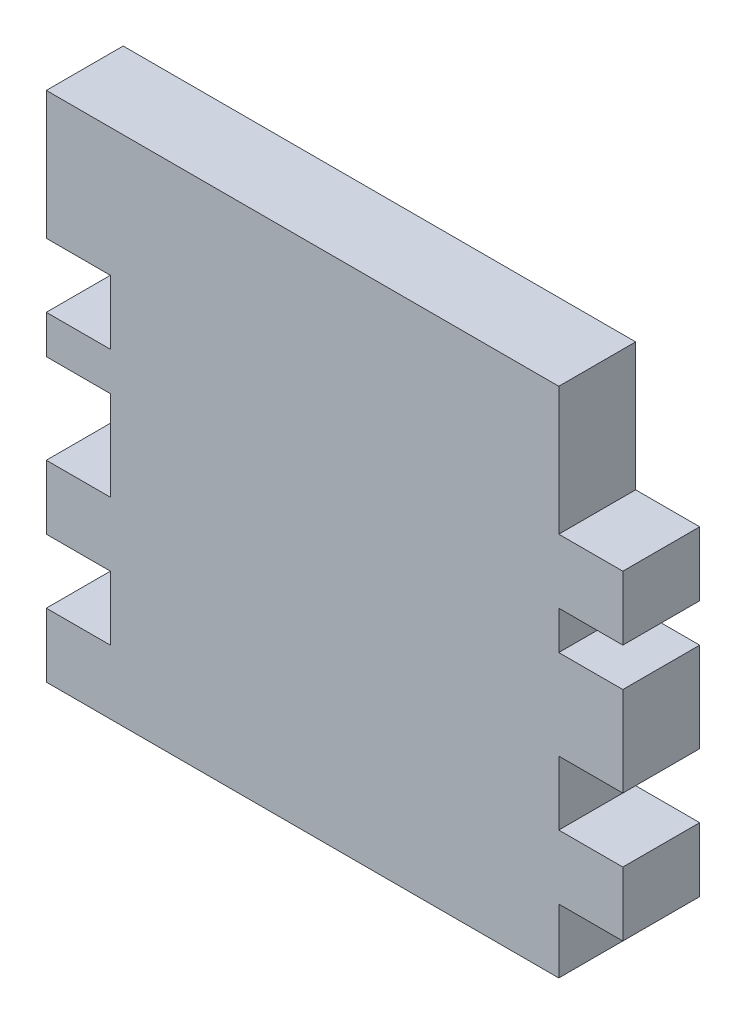
ISO-10303-21;
HEADER;
FILE_DESCRIPTION(('STEP AP214'),'2;1');
FILE_NAME('part.step','',(''),(''),'','','');
FILE_SCHEMA(('AUTOMOTIVE_DESIGN { 1 0 10303 214 1 1 1 1 }'));
ENDSEC;
DATA;
#1=APPLICATION_CONTEXT('core data for automotive mechanical design processes');
#2=APPLICATION_PROTOCOL_DEFINITION('international standard','automotive_design',2000,#1);
#3=PRODUCT_CONTEXT('',#1,'mechanical');
#4=PRODUCT('Part','Part','',(#3));
#5=PRODUCT_RELATED_PRODUCT_CATEGORY('part','',(#4));
#6=PRODUCT_DEFINITION_FORMATION('','',#4);
#7=PRODUCT_DEFINITION_CONTEXT('part definition',#1,'design');
#8=PRODUCT_DEFINITION('design','',#6,#7);
#9=PRODUCT_DEFINITION_SHAPE('','',#8);
#10=(LENGTH_UNIT() NAMED_UNIT(*) SI_UNIT(.MILLI.,.METRE.));
#11=(NAMED_UNIT(*) PLANE_ANGLE_UNIT() SI_UNIT($,.RADIAN.));
#12=(NAMED_UNIT(*) SI_UNIT($,.STERADIAN.) SOLID_ANGLE_UNIT());
#13=UNCERTAINTY_MEASURE_WITH_UNIT(LENGTH_MEASURE(1.E-05),#10,'distance_accuracy_value','');
#14=(GEOMETRIC_REPRESENTATION_CONTEXT(3) GLOBAL_UNCERTAINTY_ASSIGNED_CONTEXT((#13)) GLOBAL_UNIT_ASSIGNED_CONTEXT((#10,
#11,#12)) REPRESENTATION_CONTEXT('',''));
#15=CARTESIAN_POINT('',(0.,0.,0.));
#16=DIRECTION('',(0.,0.,1.));
#17=DIRECTION('',(1.,0.,0.));
#18=AXIS2_PLACEMENT_3D('',#15,#16,#17);
#19=CARTESIAN_POINT('',(-13.433734939759,-2.51506024096386,0.));
#20=DIRECTION('',(-1.,0.,0.));
#21=DIRECTION('',(0.,0.,1.));
#22=AXIS2_PLACEMENT_3D('',#19,#20,#21);
#23=PLANE('',#22);
#24=DIRECTION('',(0.,-1.,0.));
#25=VECTOR('',#24,1.);
#26=CARTESIAN_POINT('',(-13.433734939759,-2.51506024096386,0.));
#27=LINE('',#26,#25);
#28=CARTESIAN_POINT('',(-13.433734939759,-0.515060240963859,0.));
#29=VERTEX_POINT('',#28);
#30=CARTESIAN_POINT('',(-13.433734939759,-7.51506024096386,0.));
#31=VERTEX_POINT('',#30);
#32=EDGE_CURVE('E229',#29,#31,#27,.T.);
#33=ORIENTED_EDGE('',*,*,#32,.T.);
#34=DIRECTION('',(0.,0.,1.));
#35=VECTOR('',#34,1.);
#36=CARTESIAN_POINT('',(-13.433734939759,-7.51506024096386,0.));
#37=LINE('',#36,#35);
#38=CARTESIAN_POINT('',(-13.433734939759,-7.51506024096386,6.));
#39=VERTEX_POINT('',#38);
#40=EDGE_CURVE('E241',#31,#39,#37,.T.);
#41=ORIENTED_EDGE('',*,*,#40,.T.);
#42=DIRECTION('',(0.,-1.,0.));
#43=VECTOR('',#42,1.);
#44=CARTESIAN_POINT('',(-13.433734939759,-2.51506024096386,6.));
#45=LINE('',#44,#43);
#46=CARTESIAN_POINT('',(-13.433734939759,-0.515060240963859,6.));
#47=VERTEX_POINT('',#46);
#48=EDGE_CURVE('E251',#47,#39,#45,.T.);
#49=ORIENTED_EDGE('',*,*,#48,.F.);
#50=DIRECTION('',(0.,0.,1.));
#51=VECTOR('',#50,1.);
#52=CARTESIAN_POINT('',(-13.433734939759,-0.515060240963859,-4.));
#53=LINE('',#52,#51);
#54=EDGE_CURVE('E250',#29,#47,#53,.T.);
#55=ORIENTED_EDGE('',*,*,#54,.F.);
#56=EDGE_LOOP('',(#33,#41,#49,#55));
#57=FACE_BOUND('',#56,.T.);
#58=ADVANCED_FACE('F40',(#57),#23,.T.);
#59=CARTESIAN_POINT('',(0.,0.,6.));
#60=DIRECTION('',(0.,0.,-1.));
#61=DIRECTION('',(-1.,0.,0.));
#62=AXIS2_PLACEMENT_3D('',#59,#60,#61);
#63=PLANE('',#62);
#64=DIRECTION('',(1.,0.,0.));
#65=VECTOR('',#64,1.);
#66=CARTESIAN_POINT('',(-18.433734939759,-12.5150602409639,6.));
#67=LINE('',#66,#65);
#68=CARTESIAN_POINT('',(-18.433734939759,-12.5150602409639,6.));
#69=VERTEX_POINT('',#68);
#70=CARTESIAN_POINT('',(-13.433734939759,-12.5150602409639,6.));
#71=VERTEX_POINT('',#70);
#72=EDGE_CURVE('E272',#69,#71,#67,.T.);
#73=ORIENTED_EDGE('',*,*,#72,.T.);
#74=DIRECTION('',(0.,-1.,0.));
#75=VECTOR('',#74,1.);
#76=CARTESIAN_POINT('',(-13.433734939759,-12.5150602409639,6.));
#77=LINE('',#76,#75);
#78=CARTESIAN_POINT('',(-13.433734939759,-17.5150602409639,6.));
#79=VERTEX_POINT('',#78);
#80=EDGE_CURVE('E257',#71,#79,#77,.T.);
#81=ORIENTED_EDGE('',*,*,#80,.T.);
#82=DIRECTION('',(1.,0.,0.));
#83=VECTOR('',#82,1.);
#84=CARTESIAN_POINT('',(-18.433734939759,-17.5150602409639,6.));
#85=LINE('',#84,#83);
#86=CARTESIAN_POINT('',(-18.433734939759,-17.5150602409639,6.));
#87=VERTEX_POINT('',#86);
#88=EDGE_CURVE('E252',#87,#79,#85,.T.);
#89=ORIENTED_EDGE('',*,*,#88,.F.);
#90=DIRECTION('',(0.,-1.,0.));
#91=VECTOR('',#90,1.);
#92=CARTESIAN_POINT('',(-18.433734939759,17.4849397590361,6.));
#93=LINE('',#92,#91);
#94=CARTESIAN_POINT('',(-18.433734939759,-22.5150602409639,6.));
#95=VERTEX_POINT('',#94);
#96=EDGE_CURVE('E296',#87,#95,#93,.T.);
#97=ORIENTED_EDGE('',*,*,#96,.T.);
#98=DIRECTION('',(1.,0.,0.));
#99=VECTOR('',#98,1.);
#100=CARTESIAN_POINT('',(-18.433734939759,-22.5150602409639,6.));
#101=LINE('',#100,#99);
#102=CARTESIAN_POINT('',(21.566265060241,-22.5150602409639,6.));
#103=VERTEX_POINT('',#102);
#104=EDGE_CURVE('E284',#95,#103,#101,.T.);
#105=ORIENTED_EDGE('',*,*,#104,.T.);
#106=DIRECTION('',(0.,-1.,0.));
#107=VECTOR('',#106,1.);
#108=CARTESIAN_POINT('',(21.566265060241,0.,6.));
#109=LINE('',#108,#107);
#110=CARTESIAN_POINT('',(21.566265060241,-17.5150602409639,6.));
#111=VERTEX_POINT('',#110);
#112=EDGE_CURVE('E333',#111,#103,#109,.T.);
#113=ORIENTED_EDGE('',*,*,#112,.F.);
#114=DIRECTION('',(-1.,0.,0.));
#115=VECTOR('',#114,1.);
#116=CARTESIAN_POINT('',(0.,-17.5150602409638,6.));
#117=LINE('',#116,#115);
#118=CARTESIAN_POINT('',(26.566265060241,-17.5150602409639,6.));
#119=VERTEX_POINT('',#118);
#120=EDGE_CURVE('E337',#119,#111,#117,.T.);
#121=ORIENTED_EDGE('',*,*,#120,.F.);
#122=DIRECTION('',(0.,-1.,0.));
#123=VECTOR('',#122,1.);
#124=CARTESIAN_POINT('',(26.566265060241,17.4849397590361,6.));
#125=LINE('',#124,#123);
#126=CARTESIAN_POINT('',(26.566265060241,-12.5150602409639,6.));
#127=VERTEX_POINT('',#126);
#128=EDGE_CURVE('E287',#127,#119,#125,.T.);
#129=ORIENTED_EDGE('',*,*,#128,.F.);
#130=DIRECTION('',(-1.,0.,0.));
#131=VECTOR('',#130,1.);
#132=CARTESIAN_POINT('',(0.,-12.5150602409639,6.));
#133=LINE('',#132,#131);
#134=CARTESIAN_POINT('',(21.566265060241,-12.5150602409639,6.));
#135=VERTEX_POINT('',#134);
#136=EDGE_CURVE('E63',#127,#135,#133,.T.);
#137=ORIENTED_EDGE('',*,*,#136,.T.);
#138=DIRECTION('',(0.,1.,0.));
#139=VECTOR('',#138,1.);
#140=CARTESIAN_POINT('',(21.566265060241,0.,6.));
#141=LINE('',#140,#139);
#142=CARTESIAN_POINT('',(21.566265060241,-7.51506024096386,6.));
#143=VERTEX_POINT('',#142);
#144=EDGE_CURVE('E344',#135,#143,#141,.T.);
#145=ORIENTED_EDGE('',*,*,#144,.T.);
#146=DIRECTION('',(-1.,0.,0.));
#147=VECTOR('',#146,1.);
#148=CARTESIAN_POINT('',(0.,-7.51506024096386,6.));
#149=LINE('',#148,#147);
#150=CARTESIAN_POINT('',(26.566265060241,-7.51506024096386,6.));
#151=VERTEX_POINT('',#150);
#152=EDGE_CURVE('E438',#151,#143,#149,.T.);
#153=ORIENTED_EDGE('',*,*,#152,.F.);
#154=CARTESIAN_POINT('',(26.566265060241,-0.515060240963858,6.));
#155=VERTEX_POINT('',#154);
#156=EDGE_CURVE('E291',#155,#151,#125,.T.);
#157=ORIENTED_EDGE('',*,*,#156,.F.);
#158=DIRECTION('',(-1.,0.,0.));
#159=VECTOR('',#158,1.);
#160=CARTESIAN_POINT('',(0.,-0.51506024096386,6.));
#161=LINE('',#160,#159);
#162=CARTESIAN_POINT('',(21.566265060241,-0.515060240963858,6.));
#163=VERTEX_POINT('',#162);
#164=EDGE_CURVE('E419',#155,#163,#161,.T.);
#165=ORIENTED_EDGE('',*,*,#164,.T.);
#166=DIRECTION('',(0.,1.,0.));
#167=VECTOR('',#166,1.);
#168=CARTESIAN_POINT('',(21.566265060241,0.,6.));
#169=LINE('',#168,#167);
#170=CARTESIAN_POINT('',(21.566265060241,2.48493975903614,6.));
#171=VERTEX_POINT('',#170);
#172=EDGE_CURVE('E416',#163,#171,#169,.T.);
#173=ORIENTED_EDGE('',*,*,#172,.T.);
#174=DIRECTION('',(1.,0.,0.));
#175=VECTOR('',#174,1.);
#176=CARTESIAN_POINT('',(0.,2.48493975903614,6.));
#177=LINE('',#176,#175);
#178=CARTESIAN_POINT('',(26.566265060241,2.48493975903614,6.));
#179=VERTEX_POINT('',#178);
#180=EDGE_CURVE('E411',#171,#179,#177,.T.);
#181=ORIENTED_EDGE('',*,*,#180,.T.);
#182=CARTESIAN_POINT('',(26.566265060241,7.48493975903614,6.));
#183=VERTEX_POINT('',#182);
#184=EDGE_CURVE('E292',#183,#179,#125,.T.);
#185=ORIENTED_EDGE('',*,*,#184,.F.);
#186=DIRECTION('',(1.,0.,0.));
#187=VECTOR('',#186,1.);
#188=CARTESIAN_POINT('',(0.,7.48493975903614,6.));
#189=LINE('',#188,#187);
#190=CARTESIAN_POINT('',(21.566265060241,7.48493975903614,6.));
#191=VERTEX_POINT('',#190);
#192=EDGE_CURVE('E403',#191,#183,#189,.T.);
#193=ORIENTED_EDGE('',*,*,#192,.F.);
#194=DIRECTION('',(0.,1.,0.));
#195=VECTOR('',#194,1.);
#196=CARTESIAN_POINT('',(21.566265060241,0.,6.));
#197=LINE('',#196,#195);
#198=CARTESIAN_POINT('',(21.566265060241,17.4849397590361,6.));
#199=VERTEX_POINT('',#198);
#200=EDGE_CURVE('E428',#191,#199,#197,.T.);
#201=ORIENTED_EDGE('',*,*,#200,.T.);
#202=DIRECTION('',(1.,0.,0.));
#203=VECTOR('',#202,1.);
#204=CARTESIAN_POINT('',(-18.433734939759,17.4849397590361,6.));
#205=LINE('',#204,#203);
#206=CARTESIAN_POINT('',(-18.433734939759,17.4849397590361,6.));
#207=VERTEX_POINT('',#206);
#208=EDGE_CURVE('E293',#207,#199,#205,.T.);
#209=ORIENTED_EDGE('',*,*,#208,.F.);
#210=CARTESIAN_POINT('',(-18.433734939759,7.48493975903614,6.));
#211=VERTEX_POINT('',#210);
#212=EDGE_CURVE('E297',#207,#211,#93,.T.);
#213=ORIENTED_EDGE('',*,*,#212,.T.);
#214=DIRECTION('',(1.,0.,0.));
#215=VECTOR('',#214,1.);
#216=CARTESIAN_POINT('',(-18.433734939759,7.48493975903614,6.));
#217=LINE('',#216,#215);
#218=CARTESIAN_POINT('',(-13.433734939759,7.48493975903614,6.));
#219=VERTEX_POINT('',#218);
#220=EDGE_CURVE('E350',#211,#219,#217,.T.);
#221=ORIENTED_EDGE('',*,*,#220,.T.);
#222=DIRECTION('',(0.,-1.,0.));
#223=VECTOR('',#222,1.);
#224=CARTESIAN_POINT('',(-13.433734939759,7.48493975903614,6.));
#225=LINE('',#224,#223);
#226=CARTESIAN_POINT('',(-13.433734939759,2.48493975903614,6.));
#227=VERTEX_POINT('',#226);
#228=EDGE_CURVE('E358',#219,#227,#225,.T.);
#229=ORIENTED_EDGE('',*,*,#228,.T.);
#230=DIRECTION('',(1.,0.,0.));
#231=VECTOR('',#230,1.);
#232=CARTESIAN_POINT('',(-18.433734939759,2.48493975903614,6.));
#233=LINE('',#232,#231);
#234=CARTESIAN_POINT('',(-18.433734939759,2.48493975903614,6.));
#235=VERTEX_POINT('',#234);
#236=EDGE_CURVE('E254',#235,#227,#233,.T.);
#237=ORIENTED_EDGE('',*,*,#236,.F.);
#238=CARTESIAN_POINT('',(-18.433734939759,-0.515060240963859,6.));
#239=VERTEX_POINT('',#238);
#240=EDGE_CURVE('E300',#235,#239,#93,.T.);
#241=ORIENTED_EDGE('',*,*,#240,.T.);
#242=DIRECTION('',(1.,0.,0.));
#243=VECTOR('',#242,1.);
#244=CARTESIAN_POINT('',(0.,-0.515060240963859,6.));
#245=LINE('',#244,#243);
#246=EDGE_CURVE('E246',#239,#47,#245,.T.);
#247=ORIENTED_EDGE('',*,*,#246,.T.);
#248=ORIENTED_EDGE('',*,*,#48,.T.);
#249=DIRECTION('',(1.,0.,0.));
#250=VECTOR('',#249,1.);
#251=CARTESIAN_POINT('',(-18.433734939759,-7.51506024096386,6.));
#252=LINE('',#251,#250);
#253=CARTESIAN_POINT('',(-18.433734939759,-7.51506024096386,6.));
#254=VERTEX_POINT('',#253);
#255=EDGE_CURVE('E238',#254,#39,#252,.T.);
#256=ORIENTED_EDGE('',*,*,#255,.F.);
#257=EDGE_CURVE('E873',#254,#69,#93,.T.);
#258=ORIENTED_EDGE('',*,*,#257,.T.);
#259=EDGE_LOOP('',(#73,#81,#89,#97,#105,#113,#121,#129,#137,#145,#153,#157,#165,#173,#181,#185,
#193,#201,#209,#213,#221,#229,#237,#241,#247,#248,#256,#258));
#260=FACE_BOUND('',#259,.T.);
#261=ADVANCED_FACE('F380',(#260),#63,.F.);
#262=CARTESIAN_POINT('',(0.,0.,0.));
#263=DIRECTION('',(0.,0.,-1.));
#264=DIRECTION('',(-1.,0.,0.));
#265=AXIS2_PLACEMENT_3D('',#262,#263,#264);
#266=PLANE('',#265);
#267=DIRECTION('',(0.,-1.,0.));
#268=VECTOR('',#267,1.);
#269=CARTESIAN_POINT('',(-13.433734939759,-12.5150602409639,0.));
#270=LINE('',#269,#268);
#271=CARTESIAN_POINT('',(-13.433734939759,-12.5150602409639,0.));
#272=VERTEX_POINT('',#271);
#273=CARTESIAN_POINT('',(-13.433734939759,-17.5150602409639,0.));
#274=VERTEX_POINT('',#273);
#275=EDGE_CURVE('E280',#272,#274,#270,.T.);
#276=ORIENTED_EDGE('',*,*,#275,.F.);
#277=DIRECTION('',(1.,0.,0.));
#278=VECTOR('',#277,1.);
#279=CARTESIAN_POINT('',(-18.433734939759,-12.5150602409639,0.));
#280=LINE('',#279,#278);
#281=CARTESIAN_POINT('',(-18.433734939759,-12.5150602409639,0.));
#282=VERTEX_POINT('',#281);
#283=EDGE_CURVE('E263',#282,#272,#280,.T.);
#284=ORIENTED_EDGE('',*,*,#283,.F.);
#285=DIRECTION('',(0.,-1.,0.));
#286=VECTOR('',#285,1.);
#287=CARTESIAN_POINT('',(-18.433734939759,17.4849397590361,0.));
#288=LINE('',#287,#286);
#289=CARTESIAN_POINT('',(-18.433734939759,-7.51506024096386,0.));
#290=VERTEX_POINT('',#289);
#291=EDGE_CURVE('E233',#290,#282,#288,.T.);
#292=ORIENTED_EDGE('',*,*,#291,.F.);
#293=DIRECTION('',(1.,0.,0.));
#294=VECTOR('',#293,1.);
#295=CARTESIAN_POINT('',(-18.433734939759,-7.51506024096386,0.));
#296=LINE('',#295,#294);
#297=EDGE_CURVE('E223',#290,#31,#296,.T.);
#298=ORIENTED_EDGE('',*,*,#297,.T.);
#299=ORIENTED_EDGE('',*,*,#32,.F.);
#300=DIRECTION('',(-1.,0.,0.));
#301=VECTOR('',#300,1.);
#302=CARTESIAN_POINT('',(0.,-0.515060240963859,0.));
#303=LINE('',#302,#301);
#304=CARTESIAN_POINT('',(-18.433734939759,-0.515060240963859,0.));
#305=VERTEX_POINT('',#304);
#306=EDGE_CURVE('E340',#29,#305,#303,.T.);
#307=ORIENTED_EDGE('',*,*,#306,.T.);
#308=CARTESIAN_POINT('',(-18.433734939759,2.48493975903614,0.));
#309=VERTEX_POINT('',#308);
#310=EDGE_CURVE('E315',#309,#305,#288,.T.);
#311=ORIENTED_EDGE('',*,*,#310,.F.);
#312=DIRECTION('',(1.,0.,0.));
#313=VECTOR('',#312,1.);
#314=CARTESIAN_POINT('',(-18.433734939759,2.48493975903614,0.));
#315=LINE('',#314,#313);
#316=CARTESIAN_POINT('',(-13.433734939759,2.48493975903614,0.));
#317=VERTEX_POINT('',#316);
#318=EDGE_CURVE('E346',#309,#317,#315,.T.);
#319=ORIENTED_EDGE('',*,*,#318,.T.);
#320=DIRECTION('',(0.,-1.,0.));
#321=VECTOR('',#320,1.);
#322=CARTESIAN_POINT('',(-13.433734939759,7.48493975903614,0.));
#323=LINE('',#322,#321);
#324=CARTESIAN_POINT('',(-13.433734939759,7.48493975903614,0.));
#325=VERTEX_POINT('',#324);
#326=EDGE_CURVE('E349',#325,#317,#323,.T.);
#327=ORIENTED_EDGE('',*,*,#326,.F.);
#328=DIRECTION('',(1.,0.,0.));
#329=VECTOR('',#328,1.);
#330=CARTESIAN_POINT('',(-18.433734939759,7.48493975903614,0.));
#331=LINE('',#330,#329);
#332=CARTESIAN_POINT('',(-18.433734939759,7.48493975903614,0.));
#333=VERTEX_POINT('',#332);
#334=EDGE_CURVE('E352',#333,#325,#331,.T.);
#335=ORIENTED_EDGE('',*,*,#334,.F.);
#336=CARTESIAN_POINT('',(-18.433734939759,17.4849397590361,0.));
#337=VERTEX_POINT('',#336);
#338=EDGE_CURVE('E288',#337,#333,#288,.T.);
#339=ORIENTED_EDGE('',*,*,#338,.F.);
#340=DIRECTION('',(1.,0.,0.));
#341=VECTOR('',#340,1.);
#342=CARTESIAN_POINT('',(-18.433734939759,17.4849397590361,0.));
#343=LINE('',#342,#341);
#344=CARTESIAN_POINT('',(21.5662650602409,17.4849397590361,0.));
#345=VERTEX_POINT('',#344);
#346=EDGE_CURVE('E310',#337,#345,#343,.T.);
#347=ORIENTED_EDGE('',*,*,#346,.T.);
#348=DIRECTION('',(0.,1.,0.));
#349=VECTOR('',#348,1.);
#350=CARTESIAN_POINT('',(21.566265060241,0.,0.));
#351=LINE('',#350,#349);
#352=CARTESIAN_POINT('',(21.566265060241,7.48493975903614,0.));
#353=VERTEX_POINT('',#352);
#354=EDGE_CURVE('E497',#353,#345,#351,.T.);
#355=ORIENTED_EDGE('',*,*,#354,.F.);
#356=DIRECTION('',(1.,0.,0.));
#357=VECTOR('',#356,1.);
#358=CARTESIAN_POINT('',(0.,7.48493975903614,0.));
#359=LINE('',#358,#357);
#360=CARTESIAN_POINT('',(26.566265060241,7.48493975903614,0.));
#361=VERTEX_POINT('',#360);
#362=EDGE_CURVE('E407',#353,#361,#359,.T.);
#363=ORIENTED_EDGE('',*,*,#362,.T.);
#364=DIRECTION('',(0.,-1.,0.));
#365=VECTOR('',#364,1.);
#366=CARTESIAN_POINT('',(26.566265060241,17.4849397590361,0.));
#367=LINE('',#366,#365);
#368=CARTESIAN_POINT('',(26.566265060241,2.48493975903614,0.));
#369=VERTEX_POINT('',#368);
#370=EDGE_CURVE('E309',#361,#369,#367,.T.);
#371=ORIENTED_EDGE('',*,*,#370,.T.);
#372=DIRECTION('',(1.,0.,0.));
#373=VECTOR('',#372,1.);
#374=CARTESIAN_POINT('',(0.,2.48493975903614,0.));
#375=LINE('',#374,#373);
#376=CARTESIAN_POINT('',(21.566265060241,2.48493975903614,0.));
#377=VERTEX_POINT('',#376);
#378=EDGE_CURVE('E413',#377,#369,#375,.T.);
#379=ORIENTED_EDGE('',*,*,#378,.F.);
#380=DIRECTION('',(0.,1.,0.));
#381=VECTOR('',#380,1.);
#382=CARTESIAN_POINT('',(21.566265060241,0.,0.));
#383=LINE('',#382,#381);
#384=CARTESIAN_POINT('',(21.566265060241,-0.515060240963858,0.));
#385=VERTEX_POINT('',#384);
#386=EDGE_CURVE('E408',#385,#377,#383,.T.);
#387=ORIENTED_EDGE('',*,*,#386,.F.);
#388=DIRECTION('',(-1.,0.,0.));
#389=VECTOR('',#388,1.);
#390=CARTESIAN_POINT('',(0.,-0.51506024096386,0.));
#391=LINE('',#390,#389);
#392=CARTESIAN_POINT('',(26.566265060241,-0.515060240963858,0.));
#393=VERTEX_POINT('',#392);
#394=EDGE_CURVE('E410',#393,#385,#391,.T.);
#395=ORIENTED_EDGE('',*,*,#394,.F.);
#396=CARTESIAN_POINT('',(26.566265060241,-7.51506024096386,0.));
#397=VERTEX_POINT('',#396);
#398=EDGE_CURVE('E308',#393,#397,#367,.T.);
#399=ORIENTED_EDGE('',*,*,#398,.T.);
#400=DIRECTION('',(-1.,0.,0.));
#401=VECTOR('',#400,1.);
#402=CARTESIAN_POINT('',(0.,-7.51506024096386,0.));
#403=LINE('',#402,#401);
#404=CARTESIAN_POINT('',(21.566265060241,-7.51506024096386,0.));
#405=VERTEX_POINT('',#404);
#406=EDGE_CURVE('E440',#397,#405,#403,.T.);
#407=ORIENTED_EDGE('',*,*,#406,.T.);
#408=DIRECTION('',(0.,1.,0.));
#409=VECTOR('',#408,1.);
#410=CARTESIAN_POINT('',(21.566265060241,0.,0.));
#411=LINE('',#410,#409);
#412=CARTESIAN_POINT('',(21.566265060241,-12.5150602409639,0.));
#413=VERTEX_POINT('',#412);
#414=EDGE_CURVE('E435',#413,#405,#411,.T.);
#415=ORIENTED_EDGE('',*,*,#414,.F.);
#416=DIRECTION('',(-1.,0.,0.));
#417=VECTOR('',#416,1.);
#418=CARTESIAN_POINT('',(0.,-12.5150602409639,0.));
#419=LINE('',#418,#417);
#420=CARTESIAN_POINT('',(26.566265060241,-12.5150602409639,0.));
#421=VERTEX_POINT('',#420);
#422=EDGE_CURVE('E437',#421,#413,#419,.T.);
#423=ORIENTED_EDGE('',*,*,#422,.F.);
#424=CARTESIAN_POINT('',(26.566265060241,-17.5150602409639,0.));
#425=VERTEX_POINT('',#424);
#426=EDGE_CURVE('E304',#421,#425,#367,.T.);
#427=ORIENTED_EDGE('',*,*,#426,.T.);
#428=DIRECTION('',(-1.,0.,0.));
#429=VECTOR('',#428,1.);
#430=CARTESIAN_POINT('',(0.,-17.5150602409638,0.));
#431=LINE('',#430,#429);
#432=CARTESIAN_POINT('',(21.566265060241,-17.5150602409639,0.));
#433=VERTEX_POINT('',#432);
#434=EDGE_CURVE('E55',#425,#433,#431,.T.);
#435=ORIENTED_EDGE('',*,*,#434,.T.);
#436=DIRECTION('',(0.,-1.,0.));
#437=VECTOR('',#436,1.);
#438=CARTESIAN_POINT('',(21.566265060241,0.,0.));
#439=LINE('',#438,#437);
#440=CARTESIAN_POINT('',(21.566265060241,-22.5150602409639,0.));
#441=VERTEX_POINT('',#440);
#442=EDGE_CURVE('E327',#433,#441,#439,.T.);
#443=ORIENTED_EDGE('',*,*,#442,.T.);
#444=DIRECTION('',(1.,0.,0.));
#445=VECTOR('',#444,1.);
#446=CARTESIAN_POINT('',(-18.433734939759,-22.5150602409639,0.));
#447=LINE('',#446,#445);
#448=CARTESIAN_POINT('',(-18.433734939759,-22.5150602409639,0.));
#449=VERTEX_POINT('',#448);
#450=EDGE_CURVE('E301',#449,#441,#447,.T.);
#451=ORIENTED_EDGE('',*,*,#450,.F.);
#452=CARTESIAN_POINT('',(-18.433734939759,-17.5150602409639,0.));
#453=VERTEX_POINT('',#452);
#454=EDGE_CURVE('E313',#453,#449,#288,.T.);
#455=ORIENTED_EDGE('',*,*,#454,.F.);
#456=DIRECTION('',(1.,0.,0.));
#457=VECTOR('',#456,1.);
#458=CARTESIAN_POINT('',(-18.433734939759,-17.5150602409639,0.));
#459=LINE('',#458,#457);
#460=EDGE_CURVE('E275',#453,#274,#459,.T.);
#461=ORIENTED_EDGE('',*,*,#460,.T.);
#462=EDGE_LOOP('',(#276,#284,#292,#298,#299,#307,#311,#319,#327,#335,#339,#347,#355,#363,#371,
#379,#387,#395,#399,#407,#415,#423,#427,#435,#443,#451,#455,#461));
#463=FACE_BOUND('',#462,.T.);
#464=ADVANCED_FACE('F226',(#463),#266,.T.);
#465=CARTESIAN_POINT('',(-18.433734939759,17.4849397590361,6.));
#466=DIRECTION('',(1.,0.,0.));
#467=DIRECTION('',(0.,0.,-1.));
#468=AXIS2_PLACEMENT_3D('',#465,#466,#467);
#469=PLANE('',#468);
#470=DIRECTION('',(0.,0.,1.));
#471=VECTOR('',#470,1.);
#472=CARTESIAN_POINT('',(-18.433734939759,-0.515060240963859,-4.));
#473=LINE('',#472,#471);
#474=EDGE_CURVE('E861',#305,#239,#473,.T.);
#475=ORIENTED_EDGE('',*,*,#474,.T.);
#476=ORIENTED_EDGE('',*,*,#240,.F.);
#477=DIRECTION('',(0.,0.,1.));
#478=VECTOR('',#477,1.);
#479=CARTESIAN_POINT('',(-18.433734939759,2.48493975903614,0.));
#480=LINE('',#479,#478);
#481=EDGE_CURVE('E305',#309,#235,#480,.T.);
#482=ORIENTED_EDGE('',*,*,#481,.F.);
#483=ORIENTED_EDGE('',*,*,#310,.T.);
#484=EDGE_LOOP('',(#475,#476,#482,#483));
#485=FACE_BOUND('',#484,.T.);
#486=ADVANCED_FACE('F537',(#485),#469,.F.);
#487=CARTESIAN_POINT('',(26.566265060241,17.4849397590361,6.));
#488=DIRECTION('',(1.,0.,0.));
#489=DIRECTION('',(0.,1.,0.));
#490=AXIS2_PLACEMENT_3D('',#487,#488,#489);
#491=PLANE('',#490);
#492=DIRECTION('',(0.,0.,1.));
#493=VECTOR('',#492,1.);
#494=CARTESIAN_POINT('',(26.566265060241,7.48493975903614,0.));
#495=LINE('',#494,#493);
#496=EDGE_CURVE('E397',#361,#183,#495,.T.);
#497=ORIENTED_EDGE('',*,*,#496,.T.);
#498=ORIENTED_EDGE('',*,*,#184,.T.);
#499=DIRECTION('',(0.,0.,1.));
#500=VECTOR('',#499,1.);
#501=CARTESIAN_POINT('',(26.566265060241,2.48493975903614,0.));
#502=LINE('',#501,#500);
#503=EDGE_CURVE('E429',#369,#179,#502,.T.);
#504=ORIENTED_EDGE('',*,*,#503,.F.);
#505=ORIENTED_EDGE('',*,*,#370,.F.);
#506=EDGE_LOOP('',(#497,#498,#504,#505));
#507=FACE_BOUND('',#506,.T.);
#508=ADVANCED_FACE('F481',(#507),#491,.T.);
#509=ORIENTED_EDGE('',*,*,#398,.F.);
#510=DIRECTION('',(0.,0.,1.));
#511=VECTOR('',#510,1.);
#512=CARTESIAN_POINT('',(26.566265060241,-0.515060240963858,0.));
#513=LINE('',#512,#511);
#514=EDGE_CURVE('E431',#393,#155,#513,.T.);
#515=ORIENTED_EDGE('',*,*,#514,.T.);
#516=ORIENTED_EDGE('',*,*,#156,.T.);
#517=DIRECTION('',(0.,0.,1.));
#518=VECTOR('',#517,1.);
#519=CARTESIAN_POINT('',(26.566265060241,-7.51506024096386,0.));
#520=LINE('',#519,#518);
#521=EDGE_CURVE('E450',#397,#151,#520,.T.);
#522=ORIENTED_EDGE('',*,*,#521,.F.);
#523=EDGE_LOOP('',(#509,#515,#516,#522));
#524=FACE_BOUND('',#523,.T.);
#525=ADVANCED_FACE('F476',(#524),#491,.T.);
#526=ORIENTED_EDGE('',*,*,#426,.F.);
#527=DIRECTION('',(0.,0.,1.));
#528=VECTOR('',#527,1.);
#529=CARTESIAN_POINT('',(26.566265060241,-12.5150602409639,0.));
#530=LINE('',#529,#528);
#531=EDGE_CURVE('E452',#421,#127,#530,.T.);
#532=ORIENTED_EDGE('',*,*,#531,.T.);
#533=ORIENTED_EDGE('',*,*,#128,.T.);
#534=DIRECTION('',(0.,0.,1.));
#535=VECTOR('',#534,1.);
#536=CARTESIAN_POINT('',(26.566265060241,-17.5150602409639,0.));
#537=LINE('',#536,#535);
#538=EDGE_CURVE('E342',#425,#119,#537,.T.);
#539=ORIENTED_EDGE('',*,*,#538,.F.);
#540=EDGE_LOOP('',(#526,#532,#533,#539));
#541=FACE_BOUND('',#540,.T.);
#542=ADVANCED_FACE('F467',(#541),#491,.T.);
#543=CARTESIAN_POINT('',(-18.433734939759,17.4849397590361,6.));
#544=DIRECTION('',(0.,1.,0.));
#545=DIRECTION('',(0.,0.,1.));
#546=AXIS2_PLACEMENT_3D('',#543,#544,#545);
#547=PLANE('',#546);
#548=ORIENTED_EDGE('',*,*,#208,.T.);
#549=DIRECTION('',(0.,0.,1.));
#550=VECTOR('',#549,1.);
#551=CARTESIAN_POINT('',(21.566265060241,17.4849397590361,0.));
#552=LINE('',#551,#550);
#553=EDGE_CURVE('E271',#345,#199,#552,.T.);
#554=ORIENTED_EDGE('',*,*,#553,.F.);
#555=ORIENTED_EDGE('',*,*,#346,.F.);
#556=DIRECTION('',(0.,0.,-1.));
#557=VECTOR('',#556,1.);
#558=CARTESIAN_POINT('',(-18.433734939759,17.4849397590361,6.));
#559=LINE('',#558,#557);
#560=EDGE_CURVE('E11',#207,#337,#559,.T.);
#561=ORIENTED_EDGE('',*,*,#560,.F.);
#562=EDGE_LOOP('',(#548,#554,#555,#561));
#563=FACE_BOUND('',#562,.T.);
#564=ADVANCED_FACE('F393',(#563),#547,.T.);
#565=DIRECTION('',(0.,0.,1.));
#566=VECTOR('',#565,1.);
#567=CARTESIAN_POINT('',(-18.433734939759,7.48493975903614,0.));
#568=LINE('',#567,#566);
#569=EDGE_CURVE('E364',#333,#211,#568,.T.);
#570=ORIENTED_EDGE('',*,*,#569,.T.);
#571=ORIENTED_EDGE('',*,*,#212,.F.);
#572=ORIENTED_EDGE('',*,*,#560,.T.);
#573=ORIENTED_EDGE('',*,*,#338,.T.);
#574=EDGE_LOOP('',(#570,#571,#572,#573));
#575=FACE_BOUND('',#574,.T.);
#576=ADVANCED_FACE('F387',(#575),#469,.F.);
#577=ORIENTED_EDGE('',*,*,#257,.F.);
#578=DIRECTION('',(0.,0.,1.));
#579=VECTOR('',#578,1.);
#580=CARTESIAN_POINT('',(-18.433734939759,-7.51506024096386,0.));
#581=LINE('',#580,#579);
#582=EDGE_CURVE('E237',#290,#254,#581,.T.);
#583=ORIENTED_EDGE('',*,*,#582,.F.);
#584=ORIENTED_EDGE('',*,*,#291,.T.);
#585=DIRECTION('',(0.,0.,1.));
#586=VECTOR('',#585,1.);
#587=CARTESIAN_POINT('',(-18.433734939759,-12.5150602409639,0.));
#588=LINE('',#587,#586);
#589=EDGE_CURVE('E266',#282,#69,#588,.T.);
#590=ORIENTED_EDGE('',*,*,#589,.T.);
#591=EDGE_LOOP('',(#577,#583,#584,#590));
#592=FACE_BOUND('',#591,.T.);
#593=ADVANCED_FACE('F540',(#592),#469,.F.);
#594=CARTESIAN_POINT('',(-18.433734939759,-22.5150602409639,6.));
#595=DIRECTION('',(0.,1.,0.));
#596=DIRECTION('',(0.,0.,1.));
#597=AXIS2_PLACEMENT_3D('',#594,#595,#596);
#598=PLANE('',#597);
#599=ORIENTED_EDGE('',*,*,#450,.T.);
#600=DIRECTION('',(0.,0.,1.));
#601=VECTOR('',#600,1.);
#602=CARTESIAN_POINT('',(21.566265060241,-22.5150602409639,0.));
#603=LINE('',#602,#601);
#604=EDGE_CURVE('E331',#441,#103,#603,.T.);
#605=ORIENTED_EDGE('',*,*,#604,.T.);
#606=ORIENTED_EDGE('',*,*,#104,.F.);
#607=DIRECTION('',(0.,0.,-1.));
#608=VECTOR('',#607,1.);
#609=CARTESIAN_POINT('',(-18.433734939759,-22.5150602409639,6.));
#610=LINE('',#609,#608);
#611=EDGE_CURVE('E48',#95,#449,#610,.T.);
#612=ORIENTED_EDGE('',*,*,#611,.T.);
#613=EDGE_LOOP('',(#599,#605,#606,#612));
#614=FACE_BOUND('',#613,.T.);
#615=ADVANCED_FACE('F42',(#614),#598,.F.);
#616=ORIENTED_EDGE('',*,*,#96,.F.);
#617=DIRECTION('',(0.,0.,1.));
#618=VECTOR('',#617,1.);
#619=CARTESIAN_POINT('',(-18.433734939759,-17.5150602409639,0.));
#620=LINE('',#619,#618);
#621=EDGE_CURVE('E269',#453,#87,#620,.T.);
#622=ORIENTED_EDGE('',*,*,#621,.F.);
#623=ORIENTED_EDGE('',*,*,#454,.T.);
#624=ORIENTED_EDGE('',*,*,#611,.F.);
#625=EDGE_LOOP('',(#616,#622,#623,#624));
#626=FACE_BOUND('',#625,.T.);
#627=ADVANCED_FACE('F526',(#626),#469,.F.);
#628=CARTESIAN_POINT('',(-18.433734939759,-17.5150602409639,0.));
#629=DIRECTION('',(0.,-1.,0.));
#630=DIRECTION('',(1.,0.,0.));
#631=AXIS2_PLACEMENT_3D('',#628,#629,#630);
#632=PLANE('',#631);
#633=ORIENTED_EDGE('',*,*,#88,.T.);
#634=DIRECTION('',(0.,0.,1.));
#635=VECTOR('',#634,1.);
#636=CARTESIAN_POINT('',(-13.433734939759,-17.5150602409639,0.));
#637=LINE('',#636,#635);
#638=EDGE_CURVE('E261',#274,#79,#637,.T.);
#639=ORIENTED_EDGE('',*,*,#638,.F.);
#640=ORIENTED_EDGE('',*,*,#460,.F.);
#641=ORIENTED_EDGE('',*,*,#621,.T.);
#642=EDGE_LOOP('',(#633,#639,#640,#641));
#643=FACE_BOUND('',#642,.T.);
#644=ADVANCED_FACE('F522',(#643),#632,.F.);
#645=CARTESIAN_POINT('',(-18.433734939759,-12.5150602409639,0.));
#646=DIRECTION('',(0.,-1.,0.));
#647=DIRECTION('',(0.,0.,-1.));
#648=AXIS2_PLACEMENT_3D('',#645,#646,#647);
#649=PLANE('',#648);
#650=ORIENTED_EDGE('',*,*,#72,.F.);
#651=ORIENTED_EDGE('',*,*,#589,.F.);
#652=ORIENTED_EDGE('',*,*,#283,.T.);
#653=DIRECTION('',(0.,0.,1.));
#654=VECTOR('',#653,1.);
#655=CARTESIAN_POINT('',(-13.433734939759,-12.5150602409639,0.));
#656=LINE('',#655,#654);
#657=EDGE_CURVE('E264',#272,#71,#656,.T.);
#658=ORIENTED_EDGE('',*,*,#657,.T.);
#659=EDGE_LOOP('',(#650,#651,#652,#658));
#660=FACE_BOUND('',#659,.T.);
#661=ADVANCED_FACE('F525',(#660),#649,.T.);
#662=CARTESIAN_POINT('',(-13.433734939759,-12.5150602409639,0.));
#663=DIRECTION('',(-1.,0.,0.));
#664=DIRECTION('',(0.,0.,1.));
#665=AXIS2_PLACEMENT_3D('',#662,#663,#664);
#666=PLANE('',#665);
#667=ORIENTED_EDGE('',*,*,#80,.F.);
#668=ORIENTED_EDGE('',*,*,#657,.F.);
#669=ORIENTED_EDGE('',*,*,#275,.T.);
#670=ORIENTED_EDGE('',*,*,#638,.T.);
#671=EDGE_LOOP('',(#667,#668,#669,#670));
#672=FACE_BOUND('',#671,.T.);
#673=ADVANCED_FACE('F528',(#672),#666,.T.);
#674=CARTESIAN_POINT('',(-18.433734939759,2.48493975903614,0.));
#675=DIRECTION('',(0.,-1.,0.));
#676=DIRECTION('',(0.,0.,-1.));
#677=AXIS2_PLACEMENT_3D('',#674,#675,#676);
#678=PLANE('',#677);
#679=ORIENTED_EDGE('',*,*,#236,.T.);
#680=DIRECTION('',(0.,0.,1.));
#681=VECTOR('',#680,1.);
#682=CARTESIAN_POINT('',(-13.433734939759,2.48493975903614,0.));
#683=LINE('',#682,#681);
#684=EDGE_CURVE('E355',#317,#227,#683,.T.);
#685=ORIENTED_EDGE('',*,*,#684,.F.);
#686=ORIENTED_EDGE('',*,*,#318,.F.);
#687=ORIENTED_EDGE('',*,*,#481,.T.);
#688=EDGE_LOOP('',(#679,#685,#686,#687));
#689=FACE_BOUND('',#688,.T.);
#690=ADVANCED_FACE('F375',(#689),#678,.F.);
#691=CARTESIAN_POINT('',(-18.433734939759,7.48493975903614,0.));
#692=DIRECTION('',(0.,-1.,0.));
#693=DIRECTION('',(0.,0.,-1.));
#694=AXIS2_PLACEMENT_3D('',#691,#692,#693);
#695=PLANE('',#694);
#696=ORIENTED_EDGE('',*,*,#220,.F.);
#697=ORIENTED_EDGE('',*,*,#569,.F.);
#698=ORIENTED_EDGE('',*,*,#334,.T.);
#699=DIRECTION('',(0.,0.,1.));
#700=VECTOR('',#699,1.);
#701=CARTESIAN_POINT('',(-13.433734939759,7.48493975903614,0.));
#702=LINE('',#701,#700);
#703=EDGE_CURVE('E367',#325,#219,#702,.T.);
#704=ORIENTED_EDGE('',*,*,#703,.T.);
#705=EDGE_LOOP('',(#696,#697,#698,#704));
#706=FACE_BOUND('',#705,.T.);
#707=ADVANCED_FACE('F384',(#706),#695,.T.);
#708=CARTESIAN_POINT('',(-13.433734939759,7.48493975903614,0.));
#709=DIRECTION('',(-1.,0.,0.));
#710=DIRECTION('',(0.,0.,1.));
#711=AXIS2_PLACEMENT_3D('',#708,#709,#710);
#712=PLANE('',#711);
#713=ORIENTED_EDGE('',*,*,#228,.F.);
#714=ORIENTED_EDGE('',*,*,#703,.F.);
#715=ORIENTED_EDGE('',*,*,#326,.T.);
#716=ORIENTED_EDGE('',*,*,#684,.T.);
#717=EDGE_LOOP('',(#713,#714,#715,#716));
#718=FACE_BOUND('',#717,.T.);
#719=ADVANCED_FACE('F371',(#718),#712,.T.);
#720=CARTESIAN_POINT('',(21.566265060241,0.,0.));
#721=DIRECTION('',(1.,0.,0.));
#722=DIRECTION('',(0.,0.,-1.));
#723=AXIS2_PLACEMENT_3D('',#720,#721,#722);
#724=PLANE('',#723);
#725=ORIENTED_EDGE('',*,*,#200,.F.);
#726=DIRECTION('',(0.,0.,1.));
#727=VECTOR('',#726,1.);
#728=CARTESIAN_POINT('',(21.566265060241,7.48493975903614,0.));
#729=LINE('',#728,#727);
#730=EDGE_CURVE('E400',#353,#191,#729,.T.);
#731=ORIENTED_EDGE('',*,*,#730,.F.);
#732=ORIENTED_EDGE('',*,*,#354,.T.);
#733=ORIENTED_EDGE('',*,*,#553,.T.);
#734=EDGE_LOOP('',(#725,#731,#732,#733));
#735=FACE_BOUND('',#734,.T.);
#736=ADVANCED_FACE('F503',(#735),#724,.T.);
#737=CARTESIAN_POINT('',(0.,7.48493975903614,0.));
#738=DIRECTION('',(0.,-1.,0.));
#739=DIRECTION('',(0.,0.,-1.));
#740=AXIS2_PLACEMENT_3D('',#737,#738,#739);
#741=PLANE('',#740);
#742=ORIENTED_EDGE('',*,*,#192,.T.);
#743=ORIENTED_EDGE('',*,*,#496,.F.);
#744=ORIENTED_EDGE('',*,*,#362,.F.);
#745=ORIENTED_EDGE('',*,*,#730,.T.);
#746=EDGE_LOOP('',(#742,#743,#744,#745));
#747=FACE_BOUND('',#746,.T.);
#748=ADVANCED_FACE('F502',(#747),#741,.F.);
#749=CARTESIAN_POINT('',(0.,-17.5150602409638,0.));
#750=DIRECTION('',(0.,1.,0.));
#751=DIRECTION('',(-1.,0.,0.));
#752=AXIS2_PLACEMENT_3D('',#749,#750,#751);
#753=PLANE('',#752);
#754=ORIENTED_EDGE('',*,*,#120,.T.);
#755=DIRECTION('',(0.,0.,1.));
#756=VECTOR('',#755,1.);
#757=CARTESIAN_POINT('',(21.566265060241,-17.5150602409639,0.));
#758=LINE('',#757,#756);
#759=EDGE_CURVE('E329',#433,#111,#758,.T.);
#760=ORIENTED_EDGE('',*,*,#759,.F.);
#761=ORIENTED_EDGE('',*,*,#434,.F.);
#762=ORIENTED_EDGE('',*,*,#538,.T.);
#763=EDGE_LOOP('',(#754,#760,#761,#762));
#764=FACE_BOUND('',#763,.T.);
#765=ADVANCED_FACE('F510',(#764),#753,.F.);
#766=CARTESIAN_POINT('',(21.566265060241,0.,0.));
#767=DIRECTION('',(-1.,0.,0.));
#768=DIRECTION('',(0.,0.,1.));
#769=AXIS2_PLACEMENT_3D('',#766,#767,#768);
#770=PLANE('',#769);
#771=ORIENTED_EDGE('',*,*,#112,.T.);
#772=ORIENTED_EDGE('',*,*,#604,.F.);
#773=ORIENTED_EDGE('',*,*,#442,.F.);
#774=ORIENTED_EDGE('',*,*,#759,.T.);
#775=EDGE_LOOP('',(#771,#772,#773,#774));
#776=FACE_BOUND('',#775,.T.);
#777=ADVANCED_FACE('F694',(#776),#770,.F.);
#778=CARTESIAN_POINT('',(21.566265060241,0.,0.));
#779=DIRECTION('',(1.,0.,0.));
#780=DIRECTION('',(0.,1.,0.));
#781=AXIS2_PLACEMENT_3D('',#778,#779,#780);
#782=PLANE('',#781);
#783=ORIENTED_EDGE('',*,*,#144,.F.);
#784=DIRECTION('',(0.,0.,1.));
#785=VECTOR('',#784,1.);
#786=CARTESIAN_POINT('',(21.566265060241,-12.5150602409639,0.));
#787=LINE('',#786,#785);
#788=EDGE_CURVE('E443',#413,#135,#787,.T.);
#789=ORIENTED_EDGE('',*,*,#788,.F.);
#790=ORIENTED_EDGE('',*,*,#414,.T.);
#791=DIRECTION('',(0.,0.,1.));
#792=VECTOR('',#791,1.);
#793=CARTESIAN_POINT('',(21.566265060241,-7.51506024096386,0.));
#794=LINE('',#793,#792);
#795=EDGE_CURVE('E420',#405,#143,#794,.T.);
#796=ORIENTED_EDGE('',*,*,#795,.T.);
#797=EDGE_LOOP('',(#783,#789,#790,#796));
#798=FACE_BOUND('',#797,.T.);
#799=ADVANCED_FACE('F459',(#798),#782,.T.);
#800=CARTESIAN_POINT('',(0.,-7.51506024096386,0.));
#801=DIRECTION('',(0.,1.,0.));
#802=DIRECTION('',(0.,0.,1.));
#803=AXIS2_PLACEMENT_3D('',#800,#801,#802);
#804=PLANE('',#803);
#805=ORIENTED_EDGE('',*,*,#152,.T.);
#806=ORIENTED_EDGE('',*,*,#795,.F.);
#807=ORIENTED_EDGE('',*,*,#406,.F.);
#808=ORIENTED_EDGE('',*,*,#521,.T.);
#809=EDGE_LOOP('',(#805,#806,#807,#808));
#810=FACE_BOUND('',#809,.T.);
#811=ADVANCED_FACE('F470',(#810),#804,.F.);
#812=CARTESIAN_POINT('',(0.,-12.5150602409639,0.));
#813=DIRECTION('',(0.,1.,0.));
#814=DIRECTION('',(0.,0.,1.));
#815=AXIS2_PLACEMENT_3D('',#812,#813,#814);
#816=PLANE('',#815);
#817=ORIENTED_EDGE('',*,*,#136,.F.);
#818=ORIENTED_EDGE('',*,*,#531,.F.);
#819=ORIENTED_EDGE('',*,*,#422,.T.);
#820=ORIENTED_EDGE('',*,*,#788,.T.);
#821=EDGE_LOOP('',(#817,#818,#819,#820));
#822=FACE_BOUND('',#821,.T.);
#823=ADVANCED_FACE('F455',(#822),#816,.T.);
#824=CARTESIAN_POINT('',(21.566265060241,0.,0.));
#825=DIRECTION('',(1.,0.,0.));
#826=DIRECTION('',(0.,0.,-1.));
#827=AXIS2_PLACEMENT_3D('',#824,#825,#826);
#828=PLANE('',#827);
#829=ORIENTED_EDGE('',*,*,#172,.F.);
#830=DIRECTION('',(0.,0.,1.));
#831=VECTOR('',#830,1.);
#832=CARTESIAN_POINT('',(21.566265060241,-0.515060240963858,0.));
#833=LINE('',#832,#831);
#834=EDGE_CURVE('E415',#385,#163,#833,.T.);
#835=ORIENTED_EDGE('',*,*,#834,.F.);
#836=ORIENTED_EDGE('',*,*,#386,.T.);
#837=DIRECTION('',(0.,0.,1.));
#838=VECTOR('',#837,1.);
#839=CARTESIAN_POINT('',(21.566265060241,2.48493975903614,0.));
#840=LINE('',#839,#838);
#841=EDGE_CURVE('E425',#377,#171,#840,.T.);
#842=ORIENTED_EDGE('',*,*,#841,.T.);
#843=EDGE_LOOP('',(#829,#835,#836,#842));
#844=FACE_BOUND('',#843,.T.);
#845=ADVANCED_FACE('F491',(#844),#828,.T.);
#846=CARTESIAN_POINT('',(0.,2.48493975903614,0.));
#847=DIRECTION('',(0.,-1.,0.));
#848=DIRECTION('',(0.,0.,-1.));
#849=AXIS2_PLACEMENT_3D('',#846,#847,#848);
#850=PLANE('',#849);
#851=ORIENTED_EDGE('',*,*,#180,.F.);
#852=ORIENTED_EDGE('',*,*,#841,.F.);
#853=ORIENTED_EDGE('',*,*,#378,.T.);
#854=ORIENTED_EDGE('',*,*,#503,.T.);
#855=EDGE_LOOP('',(#851,#852,#853,#854));
#856=FACE_BOUND('',#855,.T.);
#857=ADVANCED_FACE('F488',(#856),#850,.T.);
#858=CARTESIAN_POINT('',(0.,-0.51506024096386,0.));
#859=DIRECTION('',(0.,1.,0.));
#860=DIRECTION('',(-1.,0.,0.));
#861=AXIS2_PLACEMENT_3D('',#858,#859,#860);
#862=PLANE('',#861);
#863=ORIENTED_EDGE('',*,*,#164,.F.);
#864=ORIENTED_EDGE('',*,*,#514,.F.);
#865=ORIENTED_EDGE('',*,*,#394,.T.);
#866=ORIENTED_EDGE('',*,*,#834,.T.);
#867=EDGE_LOOP('',(#863,#864,#865,#866));
#868=FACE_BOUND('',#867,.T.);
#869=ADVANCED_FACE('F746',(#868),#862,.T.);
#870=CARTESIAN_POINT('',(0.,-0.515060240963859,-4.));
#871=DIRECTION('',(0.,-1.,0.));
#872=DIRECTION('',(0.,0.,-1.));
#873=AXIS2_PLACEMENT_3D('',#870,#871,#872);
#874=PLANE('',#873);
#875=ORIENTED_EDGE('',*,*,#54,.T.);
#876=ORIENTED_EDGE('',*,*,#246,.F.);
#877=ORIENTED_EDGE('',*,*,#474,.F.);
#878=ORIENTED_EDGE('',*,*,#306,.F.);
#879=EDGE_LOOP('',(#875,#876,#877,#878));
#880=FACE_BOUND('',#879,.T.);
#881=ADVANCED_FACE('F756',(#880),#874,.T.);
#882=CARTESIAN_POINT('',(-18.433734939759,-7.51506024096386,0.));
#883=DIRECTION('',(0.,-1.,0.));
#884=DIRECTION('',(0.,0.,-1.));
#885=AXIS2_PLACEMENT_3D('',#882,#883,#884);
#886=PLANE('',#885);
#887=ORIENTED_EDGE('',*,*,#255,.T.);
#888=ORIENTED_EDGE('',*,*,#40,.F.);
#889=ORIENTED_EDGE('',*,*,#297,.F.);
#890=ORIENTED_EDGE('',*,*,#582,.T.);
#891=EDGE_LOOP('',(#887,#888,#889,#890));
#892=FACE_BOUND('',#891,.T.);
#893=ADVANCED_FACE('F242',(#892),#886,.F.);
#894=CLOSED_SHELL('',(#58,#261,#464,#486,#508,#525,#542,#564,#576,#593,#615,#627,#644,#661,#673,
#690,#707,#719,#736,#748,#765,#777,#799,#811,#823,#845,#857,#869,#881,#893));
#895=MANIFOLD_SOLID_BREP('B2',#894);
#896=ADVANCED_BREP_SHAPE_REPRESENTATION('',(#18,#895),#14);
#897=SHAPE_DEFINITION_REPRESENTATION(#9,#896);
ENDSEC;
END-ISO-10303-21;
